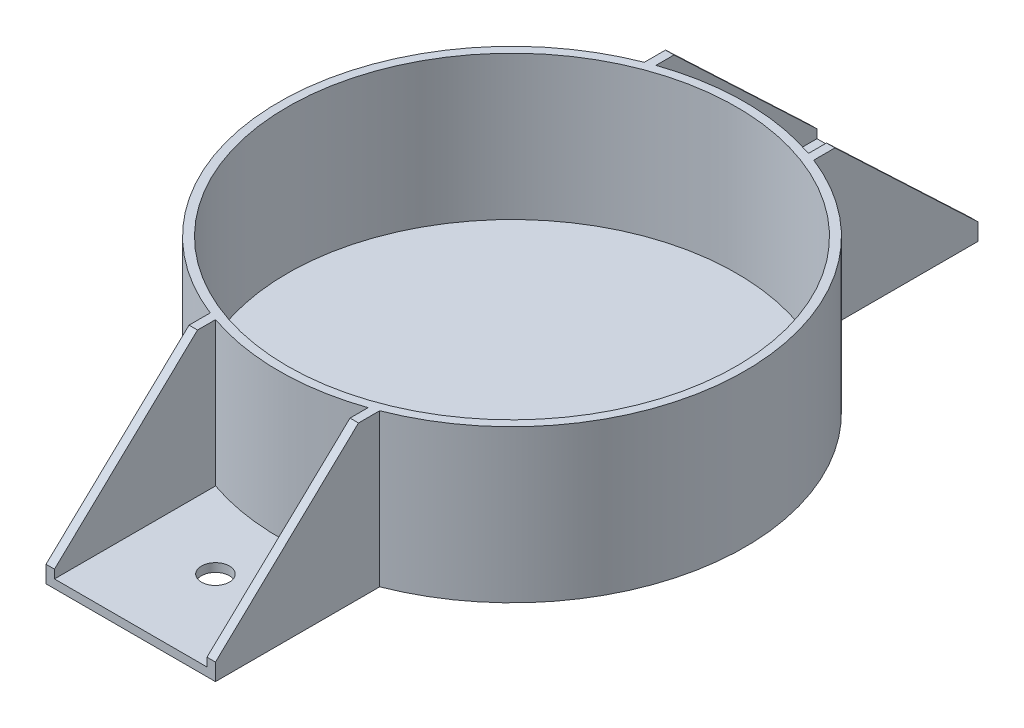
ISO-10303-21;
HEADER;
FILE_DESCRIPTION(('STEP AP214'),'2;1');
FILE_NAME('part.step','',(''),(''),'','','');
FILE_SCHEMA(('AUTOMOTIVE_DESIGN { 1 0 10303 214 1 1 1 1 }'));
ENDSEC;
DATA;
#1=APPLICATION_CONTEXT('core data for automotive mechanical design processes');
#2=APPLICATION_PROTOCOL_DEFINITION('international standard','automotive_design',2000,#1);
#3=PRODUCT_CONTEXT('',#1,'mechanical');
#4=PRODUCT('Part','Part','',(#3));
#5=PRODUCT_RELATED_PRODUCT_CATEGORY('part','',(#4));
#6=PRODUCT_DEFINITION_FORMATION('','',#4);
#7=PRODUCT_DEFINITION_CONTEXT('part definition',#1,'design');
#8=PRODUCT_DEFINITION('design','',#6,#7);
#9=PRODUCT_DEFINITION_SHAPE('','',#8);
#10=(LENGTH_UNIT() NAMED_UNIT(*) SI_UNIT(.MILLI.,.METRE.));
#11=(NAMED_UNIT(*) PLANE_ANGLE_UNIT() SI_UNIT($,.RADIAN.));
#12=(NAMED_UNIT(*) SI_UNIT($,.STERADIAN.) SOLID_ANGLE_UNIT());
#13=UNCERTAINTY_MEASURE_WITH_UNIT(LENGTH_MEASURE(1.E-05),#10,'distance_accuracy_value','');
#14=(GEOMETRIC_REPRESENTATION_CONTEXT(3) GLOBAL_UNCERTAINTY_ASSIGNED_CONTEXT((#13)) GLOBAL_UNIT_ASSIGNED_CONTEXT((#10,
#11,#12)) REPRESENTATION_CONTEXT('',''));
#15=CARTESIAN_POINT('',(0.,0.,0.));
#16=DIRECTION('',(0.,0.,1.));
#17=DIRECTION('',(1.,0.,0.));
#18=AXIS2_PLACEMENT_3D('',#15,#16,#17);
#19=CARTESIAN_POINT('',(10.,1.,-45.));
#20=DIRECTION('',(-1.,0.,0.));
#21=DIRECTION('',(0.,0.,1.));
#22=AXIS2_PLACEMENT_3D('',#19,#20,#21);
#23=PLANE('',#22);
#24=DIRECTION('',(0.,-0.687879130592936,-0.72582525561922));
#25=VECTOR('',#24,1.);
#26=CARTESIAN_POINT('',(10.,18.,-28.117376914899));
#27=LINE('',#26,#25);
#28=CARTESIAN_POINT('',(10.,18.,-28.117376914899));
#29=VERTEX_POINT('',#28);
#30=CARTESIAN_POINT('',(10.,2.,-45.));
#31=VERTEX_POINT('',#30);
#32=EDGE_CURVE('E171',#29,#31,#27,.T.);
#33=ORIENTED_EDGE('',*,*,#32,.F.);
#34=DIRECTION('',(0.,0.,-1.));
#35=VECTOR('',#34,1.);
#36=CARTESIAN_POINT('',(10.,18.,45.001));
#37=LINE('',#36,#35);
#38=CARTESIAN_POINT('',(10.,18.,-25.617376914899));
#39=VERTEX_POINT('',#38);
#40=EDGE_CURVE('E236',#39,#29,#37,.T.);
#41=ORIENTED_EDGE('',*,*,#40,.F.);
#42=DIRECTION('',(0.,-1.,0.));
#43=VECTOR('',#42,1.);
#44=CARTESIAN_POINT('',(10.,1.,-25.617376914899));
#45=LINE('',#44,#43);
#46=CARTESIAN_POINT('',(10.,0.,-25.617376914899));
#47=VERTEX_POINT('',#46);
#48=EDGE_CURVE('E195',#39,#47,#45,.T.);
#49=ORIENTED_EDGE('',*,*,#48,.T.);
#50=DIRECTION('',(0.,0.,-1.));
#51=VECTOR('',#50,1.);
#52=CARTESIAN_POINT('',(10.,0.,-45.));
#53=LINE('',#52,#51);
#54=CARTESIAN_POINT('',(10.,0.,-45.));
#55=VERTEX_POINT('',#54);
#56=EDGE_CURVE('E193',#47,#55,#53,.T.);
#57=ORIENTED_EDGE('',*,*,#56,.T.);
#58=DIRECTION('',(0.,-1.,0.));
#59=VECTOR('',#58,1.);
#60=CARTESIAN_POINT('',(10.,1.,-45.));
#61=LINE('',#60,#59);
#62=EDGE_CURVE('E186',#31,#55,#61,.T.);
#63=ORIENTED_EDGE('',*,*,#62,.F.);
#64=EDGE_LOOP('',(#33,#41,#49,#57,#63));
#65=FACE_BOUND('',#64,.T.);
#66=ADVANCED_FACE('F35',(#65),#23,.F.);
#67=CARTESIAN_POINT('',(-10.,1.,-45.));
#68=DIRECTION('',(0.,0.,1.));
#69=DIRECTION('',(1.,0.,0.));
#70=AXIS2_PLACEMENT_3D('',#67,#68,#69);
#71=PLANE('',#70);
#72=DIRECTION('',(-1.,0.,0.));
#73=VECTOR('',#72,1.);
#74=CARTESIAN_POINT('',(10.,2.,-45.));
#75=LINE('',#74,#73);
#76=CARTESIAN_POINT('',(9.,2.,-45.));
#77=VERTEX_POINT('',#76);
#78=EDGE_CURVE('E59',#31,#77,#75,.T.);
#79=ORIENTED_EDGE('',*,*,#78,.F.);
#80=ORIENTED_EDGE('',*,*,#62,.T.);
#81=DIRECTION('',(-1.,0.,0.));
#82=VECTOR('',#81,1.);
#83=CARTESIAN_POINT('',(-10.,0.,-45.));
#84=LINE('',#83,#82);
#85=CARTESIAN_POINT('',(-10.,0.,-45.));
#86=VERTEX_POINT('',#85);
#87=EDGE_CURVE('E335',#55,#86,#84,.T.);
#88=ORIENTED_EDGE('',*,*,#87,.T.);
#89=DIRECTION('',(0.,-1.,0.));
#90=VECTOR('',#89,1.);
#91=CARTESIAN_POINT('',(-10.,1.,-45.));
#92=LINE('',#91,#90);
#93=CARTESIAN_POINT('',(-10.,2.,-45.));
#94=VERTEX_POINT('',#93);
#95=EDGE_CURVE('E196',#94,#86,#92,.T.);
#96=ORIENTED_EDGE('',*,*,#95,.F.);
#97=CARTESIAN_POINT('',(-9.,2.,-45.));
#98=VERTEX_POINT('',#97);
#99=EDGE_CURVE('E179',#98,#94,#75,.T.);
#100=ORIENTED_EDGE('',*,*,#99,.F.);
#101=DIRECTION('',(0.,1.,0.));
#102=VECTOR('',#101,1.);
#103=CARTESIAN_POINT('',(-9.,1.,-45.));
#104=LINE('',#103,#102);
#105=CARTESIAN_POINT('',(-9.,1.,-45.));
#106=VERTEX_POINT('',#105);
#107=EDGE_CURVE('E247',#106,#98,#104,.T.);
#108=ORIENTED_EDGE('',*,*,#107,.F.);
#109=DIRECTION('',(-1.,0.,0.));
#110=VECTOR('',#109,1.);
#111=CARTESIAN_POINT('',(-10.,1.,-45.));
#112=LINE('',#111,#110);
#113=CARTESIAN_POINT('',(9.,1.,-45.));
#114=VERTEX_POINT('',#113);
#115=EDGE_CURVE('E319',#114,#106,#112,.T.);
#116=ORIENTED_EDGE('',*,*,#115,.F.);
#117=DIRECTION('',(0.,-1.,0.));
#118=VECTOR('',#117,1.);
#119=CARTESIAN_POINT('',(9.,1.,-45.));
#120=LINE('',#119,#118);
#121=EDGE_CURVE('E189',#77,#114,#120,.T.);
#122=ORIENTED_EDGE('',*,*,#121,.F.);
#123=EDGE_LOOP('',(#79,#80,#88,#96,#100,#108,#116,#122));
#124=FACE_BOUND('',#123,.T.);
#125=ADVANCED_FACE('F184',(#124),#71,.F.);
#126=CARTESIAN_POINT('',(-10.,1.,-25.617376914899));
#127=DIRECTION('',(1.,0.,0.));
#128=DIRECTION('',(0.,0.,-1.));
#129=AXIS2_PLACEMENT_3D('',#126,#127,#128);
#130=PLANE('',#129);
#131=DIRECTION('',(0.,-0.687879130592936,-0.72582525561922));
#132=VECTOR('',#131,1.);
#133=CARTESIAN_POINT('',(-10.,18.,-28.117376914899));
#134=LINE('',#133,#132);
#135=CARTESIAN_POINT('',(-10.,18.,-28.117376914899));
#136=VERTEX_POINT('',#135);
#137=EDGE_CURVE('E180',#136,#94,#134,.T.);
#138=ORIENTED_EDGE('',*,*,#137,.T.);
#139=ORIENTED_EDGE('',*,*,#95,.T.);
#140=DIRECTION('',(0.,0.,1.));
#141=VECTOR('',#140,1.);
#142=CARTESIAN_POINT('',(-10.,0.,-25.617376914899));
#143=LINE('',#142,#141);
#144=CARTESIAN_POINT('',(-10.,0.,-25.617376914899));
#145=VERTEX_POINT('',#144);
#146=EDGE_CURVE('E320',#86,#145,#143,.T.);
#147=ORIENTED_EDGE('',*,*,#146,.T.);
#148=DIRECTION('',(0.,-1.,0.));
#149=VECTOR('',#148,1.);
#150=CARTESIAN_POINT('',(-10.,1.,-25.617376914899));
#151=LINE('',#150,#149);
#152=CARTESIAN_POINT('',(-10.,18.,-25.617376914899));
#153=VERTEX_POINT('',#152);
#154=EDGE_CURVE('E200',#153,#145,#151,.T.);
#155=ORIENTED_EDGE('',*,*,#154,.F.);
#156=DIRECTION('',(0.,0.,-1.));
#157=VECTOR('',#156,1.);
#158=CARTESIAN_POINT('',(-10.,18.,45.001));
#159=LINE('',#158,#157);
#160=EDGE_CURVE('E246',#153,#136,#159,.T.);
#161=ORIENTED_EDGE('',*,*,#160,.T.);
#162=EDGE_LOOP('',(#138,#139,#147,#155,#161));
#163=FACE_BOUND('',#162,.T.);
#164=ADVANCED_FACE('F368',(#163),#130,.F.);
#165=CARTESIAN_POINT('',(0.,18.,0.));
#166=DIRECTION('',(0.,1.,0.));
#167=DIRECTION('',(0.,0.,1.));
#168=AXIS2_PLACEMENT_3D('',#165,#166,#167);
#169=PLANE('',#168);
#170=CARTESIAN_POINT('',(0.,18.,0.));
#171=DIRECTION('',(0.,1.,0.));
#172=DIRECTION('',(0.,0.,1.));
#173=AXIS2_PLACEMENT_3D('',#170,#171,#172);
#174=CIRCLE('',#173,26.5);
#175=CARTESIAN_POINT('',(0.,18.,26.5));
#176=VERTEX_POINT('',#175);
#177=EDGE_CURVE('E303',#176,#176,#174,.T.);
#178=ORIENTED_EDGE('',*,*,#177,.F.);
#179=EDGE_LOOP('',(#178));
#180=FACE_BOUND('',#179,.T.);
#181=ORIENTED_EDGE('',*,*,#40,.T.);
#182=DIRECTION('',(-1.,0.,0.));
#183=VECTOR('',#182,1.);
#184=CARTESIAN_POINT('',(10.,18.,-28.117376914899));
#185=LINE('',#184,#183);
#186=CARTESIAN_POINT('',(9.,18.,-28.117376914899));
#187=VERTEX_POINT('',#186);
#188=EDGE_CURVE('E174',#29,#187,#185,.T.);
#189=ORIENTED_EDGE('',*,*,#188,.T.);
#190=DIRECTION('',(0.,0.,-1.));
#191=VECTOR('',#190,1.);
#192=CARTESIAN_POINT('',(9.,18.,45.001));
#193=LINE('',#192,#191);
#194=CARTESIAN_POINT('',(9.00000000000001,18.,-25.9855729203726));
#195=VERTEX_POINT('',#194);
#196=EDGE_CURVE('E239',#195,#187,#193,.T.);
#197=ORIENTED_EDGE('',*,*,#196,.F.);
#198=CARTESIAN_POINT('',(0.,18.,0.));
#199=DIRECTION('',(0.,1.,0.));
#200=DIRECTION('',(0.,0.,1.));
#201=AXIS2_PLACEMENT_3D('',#198,#199,#200);
#202=CIRCLE('',#201,27.5);
#203=CARTESIAN_POINT('',(-9.,18.,-25.9855729203726));
#204=VERTEX_POINT('',#203);
#205=EDGE_CURVE('E314',#195,#204,#202,.T.);
#206=ORIENTED_EDGE('',*,*,#205,.T.);
#207=DIRECTION('',(0.,0.,-1.));
#208=VECTOR('',#207,1.);
#209=CARTESIAN_POINT('',(-9.,18.,45.001));
#210=LINE('',#209,#208);
#211=CARTESIAN_POINT('',(-9.,18.,-28.117376914899));
#212=VERTEX_POINT('',#211);
#213=EDGE_CURVE('E250',#204,#212,#210,.T.);
#214=ORIENTED_EDGE('',*,*,#213,.T.);
#215=EDGE_CURVE('E52',#212,#136,#185,.T.);
#216=ORIENTED_EDGE('',*,*,#215,.T.);
#217=ORIENTED_EDGE('',*,*,#160,.F.);
#218=CARTESIAN_POINT('',(-10.,18.,25.617376914899));
#219=VERTEX_POINT('',#218);
#220=EDGE_CURVE('E306',#153,#219,#202,.T.);
#221=ORIENTED_EDGE('',*,*,#220,.T.);
#222=DIRECTION('',(0.,0.,1.));
#223=VECTOR('',#222,1.);
#224=CARTESIAN_POINT('',(-10.,18.,-45.001));
#225=LINE('',#224,#223);
#226=CARTESIAN_POINT('',(-10.,18.,28.117376914899));
#227=VERTEX_POINT('',#226);
#228=EDGE_CURVE('E295',#219,#227,#225,.T.);
#229=ORIENTED_EDGE('',*,*,#228,.T.);
#230=DIRECTION('',(-1.,0.,0.));
#231=VECTOR('',#230,1.);
#232=CARTESIAN_POINT('',(10.,18.,28.117376914899));
#233=LINE('',#232,#231);
#234=CARTESIAN_POINT('',(-9.,18.,28.117376914899));
#235=VERTEX_POINT('',#234);
#236=EDGE_CURVE('E265',#235,#227,#233,.T.);
#237=ORIENTED_EDGE('',*,*,#236,.F.);
#238=DIRECTION('',(0.,0.,1.));
#239=VECTOR('',#238,1.);
#240=CARTESIAN_POINT('',(-9.,18.,-45.001));
#241=LINE('',#240,#239);
#242=CARTESIAN_POINT('',(-9.,18.,25.9855729203726));
#243=VERTEX_POINT('',#242);
#244=EDGE_CURVE('E294',#243,#235,#241,.T.);
#245=ORIENTED_EDGE('',*,*,#244,.F.);
#246=CARTESIAN_POINT('',(9.,18.,25.9855729203726));
#247=VERTEX_POINT('',#246);
#248=EDGE_CURVE('E309',#243,#247,#202,.T.);
#249=ORIENTED_EDGE('',*,*,#248,.T.);
#250=DIRECTION('',(0.,0.,1.));
#251=VECTOR('',#250,1.);
#252=CARTESIAN_POINT('',(9.,18.,-45.001));
#253=LINE('',#252,#251);
#254=CARTESIAN_POINT('',(9.,18.,28.117376914899));
#255=VERTEX_POINT('',#254);
#256=EDGE_CURVE('E284',#247,#255,#253,.T.);
#257=ORIENTED_EDGE('',*,*,#256,.T.);
#258=CARTESIAN_POINT('',(10.,18.,28.117376914899));
#259=VERTEX_POINT('',#258);
#260=EDGE_CURVE('E272',#259,#255,#233,.T.);
#261=ORIENTED_EDGE('',*,*,#260,.F.);
#262=DIRECTION('',(0.,0.,1.));
#263=VECTOR('',#262,1.);
#264=CARTESIAN_POINT('',(10.,18.,-45.001));
#265=LINE('',#264,#263);
#266=CARTESIAN_POINT('',(10.,18.,25.617376914899));
#267=VERTEX_POINT('',#266);
#268=EDGE_CURVE('E279',#267,#259,#265,.T.);
#269=ORIENTED_EDGE('',*,*,#268,.F.);
#270=EDGE_CURVE('E313',#267,#39,#202,.T.);
#271=ORIENTED_EDGE('',*,*,#270,.T.);
#272=EDGE_LOOP('',(#181,#189,#197,#206,#214,#216,#217,#221,#229,#237,#245,#249,#257,#261,#269,#271));
#273=FACE_BOUND('',#272,.T.);
#274=ADVANCED_FACE('F356',(#180,#273),#169,.T.);
#275=CARTESIAN_POINT('',(-9.,1.,45.001));
#276=DIRECTION('',(-1.,0.,0.));
#277=DIRECTION('',(0.,0.,1.));
#278=AXIS2_PLACEMENT_3D('',#275,#276,#277);
#279=PLANE('',#278);
#280=DIRECTION('',(0.,-0.687879130592936,-0.72582525561922));
#281=VECTOR('',#280,1.);
#282=CARTESIAN_POINT('',(-9.,46.4625257035375,1.91525392902749));
#283=LINE('',#282,#281);
#284=EDGE_CURVE('E231',#212,#98,#283,.T.);
#285=ORIENTED_EDGE('',*,*,#284,.F.);
#286=ORIENTED_EDGE('',*,*,#213,.F.);
#287=DIRECTION('',(0.,-1.,0.));
#288=VECTOR('',#287,1.);
#289=CARTESIAN_POINT('',(-9.,1.,-25.9855729203726));
#290=LINE('',#289,#288);
#291=CARTESIAN_POINT('',(-9.,1.,-25.9855729203726));
#292=VERTEX_POINT('',#291);
#293=EDGE_CURVE('E256',#292,#204,#290,.F.);
#294=ORIENTED_EDGE('',*,*,#293,.F.);
#295=DIRECTION('',(0.,0.,-1.));
#296=VECTOR('',#295,1.);
#297=CARTESIAN_POINT('',(-9.,1.,45.001));
#298=LINE('',#297,#296);
#299=EDGE_CURVE('E251',#292,#106,#298,.T.);
#300=ORIENTED_EDGE('',*,*,#299,.T.);
#301=ORIENTED_EDGE('',*,*,#107,.T.);
#302=EDGE_LOOP('',(#285,#286,#294,#300,#301));
#303=FACE_BOUND('',#302,.T.);
#304=ADVANCED_FACE('F375',(#303),#279,.F.);
#305=CARTESIAN_POINT('',(9.,1.,45.001));
#306=DIRECTION('',(1.,0.,0.));
#307=DIRECTION('',(0.,0.,-1.));
#308=AXIS2_PLACEMENT_3D('',#305,#306,#307);
#309=PLANE('',#308);
#310=DIRECTION('',(0.,0.687879130592936,0.72582525561922));
#311=VECTOR('',#310,1.);
#312=CARTESIAN_POINT('',(9.,46.4625257035375,1.91525392902749));
#313=LINE('',#312,#311);
#314=EDGE_CURVE('E11',#77,#187,#313,.T.);
#315=ORIENTED_EDGE('',*,*,#314,.F.);
#316=ORIENTED_EDGE('',*,*,#121,.T.);
#317=DIRECTION('',(0.,0.,-1.));
#318=VECTOR('',#317,1.);
#319=CARTESIAN_POINT('',(9.,1.,45.001));
#320=LINE('',#319,#318);
#321=CARTESIAN_POINT('',(9.,1.,-25.9855729203726));
#322=VERTEX_POINT('',#321);
#323=EDGE_CURVE('E235',#322,#114,#320,.T.);
#324=ORIENTED_EDGE('',*,*,#323,.F.);
#325=DIRECTION('',(0.,-1.,0.));
#326=VECTOR('',#325,1.);
#327=CARTESIAN_POINT('',(9.,1.,-25.9855729203726));
#328=LINE('',#327,#326);
#329=EDGE_CURVE('E238',#195,#322,#328,.T.);
#330=ORIENTED_EDGE('',*,*,#329,.F.);
#331=ORIENTED_EDGE('',*,*,#196,.T.);
#332=EDGE_LOOP('',(#315,#316,#324,#330,#331));
#333=FACE_BOUND('',#332,.T.);
#334=ADVANCED_FACE('F383',(#333),#309,.F.);
#335=CARTESIAN_POINT('',(0.,1.,0.));
#336=DIRECTION('',(0.,1.,0.));
#337=DIRECTION('',(0.,0.,1.));
#338=AXIS2_PLACEMENT_3D('',#335,#336,#337);
#339=PLANE('',#338);
#340=CARTESIAN_POINT('',(0.,1.,-35.));
#341=DIRECTION('',(0.,1.,0.));
#342=DIRECTION('',(0.,0.,1.));
#343=AXIS2_PLACEMENT_3D('',#340,#341,#342);
#344=CIRCLE('',#343,1.65);
#345=CARTESIAN_POINT('',(0.,1.,-33.35));
#346=VERTEX_POINT('',#345);
#347=EDGE_CURVE('E217',#346,#346,#344,.T.);
#348=ORIENTED_EDGE('',*,*,#347,.F.);
#349=EDGE_LOOP('',(#348));
#350=FACE_BOUND('',#349,.T.);
#351=CARTESIAN_POINT('',(0.,1.,0.));
#352=DIRECTION('',(0.,1.,0.));
#353=DIRECTION('',(0.,0.,1.));
#354=AXIS2_PLACEMENT_3D('',#351,#352,#353);
#355=CIRCLE('',#354,27.5);
#356=EDGE_CURVE('E214',#322,#292,#355,.T.);
#357=ORIENTED_EDGE('',*,*,#356,.F.);
#358=ORIENTED_EDGE('',*,*,#323,.T.);
#359=ORIENTED_EDGE('',*,*,#115,.T.);
#360=ORIENTED_EDGE('',*,*,#299,.F.);
#361=EDGE_LOOP('',(#357,#358,#359,#360));
#362=FACE_BOUND('',#361,.T.);
#363=ADVANCED_FACE('F381',(#350,#362),#339,.T.);
#364=CARTESIAN_POINT('',(0.,1.,0.));
#365=DIRECTION('',(0.,-1.,0.));
#366=DIRECTION('',(0.,0.,-1.));
#367=AXIS2_PLACEMENT_3D('',#364,#365,#366);
#368=CYLINDRICAL_SURFACE('',#367,27.5);
#369=ORIENTED_EDGE('',*,*,#329,.T.);
#370=ORIENTED_EDGE('',*,*,#356,.T.);
#371=ORIENTED_EDGE('',*,*,#293,.T.);
#372=ORIENTED_EDGE('',*,*,#205,.F.);
#373=EDGE_LOOP('',(#369,#370,#371,#372));
#374=FACE_BOUND('',#373,.T.);
#375=ADVANCED_FACE('F378',(#374),#368,.T.);
#376=ORIENTED_EDGE('',*,*,#48,.F.);
#377=ORIENTED_EDGE('',*,*,#270,.F.);
#378=DIRECTION('',(0.,-1.,0.));
#379=VECTOR('',#378,1.);
#380=CARTESIAN_POINT('',(10.,1.,25.617376914899));
#381=LINE('',#380,#379);
#382=CARTESIAN_POINT('',(10.,0.,25.617376914899));
#383=VERTEX_POINT('',#382);
#384=EDGE_CURVE('E198',#267,#383,#381,.T.);
#385=ORIENTED_EDGE('',*,*,#384,.T.);
#386=CARTESIAN_POINT('',(0.,0.,0.));
#387=DIRECTION('',(0.,1.,0.));
#388=DIRECTION('',(0.,0.,1.));
#389=AXIS2_PLACEMENT_3D('',#386,#387,#388);
#390=CIRCLE('',#389,27.5);
#391=EDGE_CURVE('E332',#383,#47,#390,.T.);
#392=ORIENTED_EDGE('',*,*,#391,.T.);
#393=EDGE_LOOP('',(#376,#377,#385,#392));
#394=FACE_BOUND('',#393,.T.);
#395=ADVANCED_FACE('F363',(#394),#368,.T.);
#396=ORIENTED_EDGE('',*,*,#220,.F.);
#397=ORIENTED_EDGE('',*,*,#154,.T.);
#398=CARTESIAN_POINT('',(0.,0.,0.));
#399=DIRECTION('',(0.,1.,0.));
#400=DIRECTION('',(0.,0.,1.));
#401=AXIS2_PLACEMENT_3D('',#398,#399,#400);
#402=CIRCLE('',#401,27.5);
#403=CARTESIAN_POINT('',(-10.,0.,25.617376914899));
#404=VERTEX_POINT('',#403);
#405=EDGE_CURVE('E312',#145,#404,#402,.T.);
#406=ORIENTED_EDGE('',*,*,#405,.T.);
#407=DIRECTION('',(0.,-1.,0.));
#408=VECTOR('',#407,1.);
#409=CARTESIAN_POINT('',(-10.,1.,25.617376914899));
#410=LINE('',#409,#408);
#411=EDGE_CURVE('E210',#219,#404,#410,.T.);
#412=ORIENTED_EDGE('',*,*,#411,.F.);
#413=EDGE_LOOP('',(#396,#397,#406,#412));
#414=FACE_BOUND('',#413,.T.);
#415=ADVANCED_FACE('F341',(#414),#368,.T.);
#416=CARTESIAN_POINT('',(-9.,1.,25.9855729203726));
#417=VERTEX_POINT('',#416);
#418=CARTESIAN_POINT('',(9.,1.,25.9855729203726));
#419=VERTEX_POINT('',#418);
#420=EDGE_CURVE('E213',#417,#419,#355,.T.);
#421=ORIENTED_EDGE('',*,*,#420,.T.);
#422=DIRECTION('',(0.,-1.,0.));
#423=VECTOR('',#422,1.);
#424=CARTESIAN_POINT('',(9.,1.,25.9855729203726));
#425=LINE('',#424,#423);
#426=EDGE_CURVE('E275',#247,#419,#425,.T.);
#427=ORIENTED_EDGE('',*,*,#426,.F.);
#428=ORIENTED_EDGE('',*,*,#248,.F.);
#429=DIRECTION('',(0.,-1.,0.));
#430=VECTOR('',#429,1.);
#431=CARTESIAN_POINT('',(-9.,1.,25.9855729203726));
#432=LINE('',#431,#430);
#433=EDGE_CURVE('E292',#417,#243,#432,.F.);
#434=ORIENTED_EDGE('',*,*,#433,.F.);
#435=EDGE_LOOP('',(#421,#427,#428,#434));
#436=FACE_BOUND('',#435,.T.);
#437=ADVANCED_FACE('F406',(#436),#368,.T.);
#438=CARTESIAN_POINT('',(-10.,1.,25.617376914899));
#439=DIRECTION('',(1.,0.,0.));
#440=DIRECTION('',(0.,0.,-1.));
#441=AXIS2_PLACEMENT_3D('',#438,#439,#440);
#442=PLANE('',#441);
#443=DIRECTION('',(0.,-1.,0.));
#444=VECTOR('',#443,1.);
#445=CARTESIAN_POINT('',(-10.,1.,45.));
#446=LINE('',#445,#444);
#447=CARTESIAN_POINT('',(-10.,2.,45.));
#448=VERTEX_POINT('',#447);
#449=CARTESIAN_POINT('',(-10.,0.,45.));
#450=VERTEX_POINT('',#449);
#451=EDGE_CURVE('E208',#448,#450,#446,.T.);
#452=ORIENTED_EDGE('',*,*,#451,.F.);
#453=DIRECTION('',(0.,-0.687879130592936,0.72582525561922));
#454=VECTOR('',#453,1.);
#455=CARTESIAN_POINT('',(-10.,18.,28.117376914899));
#456=LINE('',#455,#454);
#457=EDGE_CURVE('E261',#227,#448,#456,.T.);
#458=ORIENTED_EDGE('',*,*,#457,.F.);
#459=ORIENTED_EDGE('',*,*,#228,.F.);
#460=ORIENTED_EDGE('',*,*,#411,.T.);
#461=DIRECTION('',(0.,0.,1.));
#462=VECTOR('',#461,1.);
#463=CARTESIAN_POINT('',(-10.,0.,25.617376914899));
#464=LINE('',#463,#462);
#465=EDGE_CURVE('E324',#404,#450,#464,.T.);
#466=ORIENTED_EDGE('',*,*,#465,.T.);
#467=EDGE_LOOP('',(#452,#458,#459,#460,#466));
#468=FACE_BOUND('',#467,.T.);
#469=ADVANCED_FACE('F37',(#468),#442,.F.);
#470=CARTESIAN_POINT('',(-10.,1.,45.));
#471=DIRECTION('',(0.,0.,-1.));
#472=DIRECTION('',(-1.,0.,0.));
#473=AXIS2_PLACEMENT_3D('',#470,#471,#472);
#474=PLANE('',#473);
#475=DIRECTION('',(0.,-1.,0.));
#476=VECTOR('',#475,1.);
#477=CARTESIAN_POINT('',(10.,1.,45.));
#478=LINE('',#477,#476);
#479=CARTESIAN_POINT('',(10.,2.,45.));
#480=VERTEX_POINT('',#479);
#481=CARTESIAN_POINT('',(10.,0.,45.));
#482=VERTEX_POINT('',#481);
#483=EDGE_CURVE('E206',#480,#482,#478,.T.);
#484=ORIENTED_EDGE('',*,*,#483,.F.);
#485=DIRECTION('',(-1.,0.,0.));
#486=VECTOR('',#485,1.);
#487=CARTESIAN_POINT('',(10.,2.,45.));
#488=LINE('',#487,#486);
#489=CARTESIAN_POINT('',(9.,2.,45.));
#490=VERTEX_POINT('',#489);
#491=EDGE_CURVE('E267',#480,#490,#488,.T.);
#492=ORIENTED_EDGE('',*,*,#491,.T.);
#493=DIRECTION('',(0.,-1.,0.));
#494=VECTOR('',#493,1.);
#495=CARTESIAN_POINT('',(9.,1.,45.));
#496=LINE('',#495,#494);
#497=CARTESIAN_POINT('',(9.,1.,45.));
#498=VERTEX_POINT('',#497);
#499=EDGE_CURVE('E276',#490,#498,#496,.T.);
#500=ORIENTED_EDGE('',*,*,#499,.T.);
#501=DIRECTION('',(1.,0.,0.));
#502=VECTOR('',#501,1.);
#503=CARTESIAN_POINT('',(-10.,1.,45.));
#504=LINE('',#503,#502);
#505=CARTESIAN_POINT('',(-9.,1.,45.));
#506=VERTEX_POINT('',#505);
#507=EDGE_CURVE('E316',#506,#498,#504,.T.);
#508=ORIENTED_EDGE('',*,*,#507,.F.);
#509=DIRECTION('',(0.,1.,0.));
#510=VECTOR('',#509,1.);
#511=CARTESIAN_POINT('',(-9.,1.,45.));
#512=LINE('',#511,#510);
#513=CARTESIAN_POINT('',(-9.,1.99999999999999,45.));
#514=VERTEX_POINT('',#513);
#515=EDGE_CURVE('E278',#506,#514,#512,.T.);
#516=ORIENTED_EDGE('',*,*,#515,.T.);
#517=EDGE_CURVE('E271',#514,#448,#488,.T.);
#518=ORIENTED_EDGE('',*,*,#517,.T.);
#519=ORIENTED_EDGE('',*,*,#451,.T.);
#520=DIRECTION('',(1.,0.,0.));
#521=VECTOR('',#520,1.);
#522=CARTESIAN_POINT('',(-10.,0.,45.));
#523=LINE('',#522,#521);
#524=EDGE_CURVE('E327',#450,#482,#523,.T.);
#525=ORIENTED_EDGE('',*,*,#524,.T.);
#526=EDGE_LOOP('',(#484,#492,#500,#508,#516,#518,#519,#525));
#527=FACE_BOUND('',#526,.T.);
#528=ADVANCED_FACE('F409',(#527),#474,.F.);
#529=CARTESIAN_POINT('',(10.,1.,45.));
#530=DIRECTION('',(-1.,0.,0.));
#531=DIRECTION('',(0.,0.,1.));
#532=AXIS2_PLACEMENT_3D('',#529,#530,#531);
#533=PLANE('',#532);
#534=ORIENTED_EDGE('',*,*,#268,.T.);
#535=DIRECTION('',(0.,-0.687879130592936,0.72582525561922));
#536=VECTOR('',#535,1.);
#537=CARTESIAN_POINT('',(10.,18.,28.117376914899));
#538=LINE('',#537,#536);
#539=EDGE_CURVE('E262',#259,#480,#538,.T.);
#540=ORIENTED_EDGE('',*,*,#539,.T.);
#541=ORIENTED_EDGE('',*,*,#483,.T.);
#542=DIRECTION('',(0.,0.,-1.));
#543=VECTOR('',#542,1.);
#544=CARTESIAN_POINT('',(10.,0.,45.));
#545=LINE('',#544,#543);
#546=EDGE_CURVE('E330',#482,#383,#545,.T.);
#547=ORIENTED_EDGE('',*,*,#546,.T.);
#548=ORIENTED_EDGE('',*,*,#384,.F.);
#549=EDGE_LOOP('',(#534,#540,#541,#547,#548));
#550=FACE_BOUND('',#549,.T.);
#551=ADVANCED_FACE('F407',(#550),#533,.F.);
#552=CARTESIAN_POINT('',(0.,1.,35.));
#553=DIRECTION('',(0.,1.,0.));
#554=DIRECTION('',(0.,0.,-1.));
#555=AXIS2_PLACEMENT_3D('',#552,#553,#554);
#556=CIRCLE('',#555,1.65);
#557=CARTESIAN_POINT('',(0.,1.,33.35));
#558=VERTEX_POINT('',#557);
#559=EDGE_CURVE('E222',#558,#558,#556,.T.);
#560=ORIENTED_EDGE('',*,*,#559,.F.);
#561=EDGE_LOOP('',(#560));
#562=FACE_BOUND('',#561,.T.);
#563=DIRECTION('',(0.,0.,1.));
#564=VECTOR('',#563,1.);
#565=CARTESIAN_POINT('',(9.,1.,-45.001));
#566=LINE('',#565,#564);
#567=EDGE_CURVE('E281',#419,#498,#566,.T.);
#568=ORIENTED_EDGE('',*,*,#567,.F.);
#569=ORIENTED_EDGE('',*,*,#420,.F.);
#570=DIRECTION('',(0.,0.,1.));
#571=VECTOR('',#570,1.);
#572=CARTESIAN_POINT('',(-9.,1.,-45.001));
#573=LINE('',#572,#571);
#574=EDGE_CURVE('E291',#417,#506,#573,.T.);
#575=ORIENTED_EDGE('',*,*,#574,.T.);
#576=ORIENTED_EDGE('',*,*,#507,.T.);
#577=EDGE_LOOP('',(#568,#569,#575,#576));
#578=FACE_BOUND('',#577,.T.);
#579=ADVANCED_FACE('F393',(#562,#578),#339,.T.);
#580=CARTESIAN_POINT('',(0.,0.,0.));
#581=DIRECTION('',(0.,1.,0.));
#582=DIRECTION('',(0.,0.,1.));
#583=AXIS2_PLACEMENT_3D('',#580,#581,#582);
#584=PLANE('',#583);
#585=CARTESIAN_POINT('',(0.,0.,-35.));
#586=DIRECTION('',(0.,1.,0.));
#587=DIRECTION('',(0.,0.,1.));
#588=AXIS2_PLACEMENT_3D('',#585,#586,#587);
#589=CIRCLE('',#588,1.65);
#590=CARTESIAN_POINT('',(0.,0.,-33.35));
#591=VERTEX_POINT('',#590);
#592=EDGE_CURVE('E39',#591,#591,#589,.T.);
#593=ORIENTED_EDGE('',*,*,#592,.T.);
#594=EDGE_LOOP('',(#593));
#595=FACE_BOUND('',#594,.T.);
#596=CARTESIAN_POINT('',(0.,0.,35.));
#597=DIRECTION('',(0.,1.,0.));
#598=DIRECTION('',(0.,0.,1.));
#599=AXIS2_PLACEMENT_3D('',#596,#597,#598);
#600=CIRCLE('',#599,1.65);
#601=CARTESIAN_POINT('',(0.,0.,36.65));
#602=VERTEX_POINT('',#601);
#603=EDGE_CURVE('E215',#602,#602,#600,.T.);
#604=ORIENTED_EDGE('',*,*,#603,.T.);
#605=EDGE_LOOP('',(#604));
#606=FACE_BOUND('',#605,.T.);
#607=ORIENTED_EDGE('',*,*,#405,.F.);
#608=ORIENTED_EDGE('',*,*,#146,.F.);
#609=ORIENTED_EDGE('',*,*,#87,.F.);
#610=ORIENTED_EDGE('',*,*,#56,.F.);
#611=ORIENTED_EDGE('',*,*,#391,.F.);
#612=ORIENTED_EDGE('',*,*,#546,.F.);
#613=ORIENTED_EDGE('',*,*,#524,.F.);
#614=ORIENTED_EDGE('',*,*,#465,.F.);
#615=EDGE_LOOP('',(#607,#608,#609,#610,#611,#612,#613,#614));
#616=FACE_BOUND('',#615,.T.);
#617=ADVANCED_FACE('F347',(#595,#606,#616),#584,.F.);
#618=CARTESIAN_POINT('',(0.,18.,0.));
#619=DIRECTION('',(0.,-1.,0.));
#620=DIRECTION('',(0.,0.,-1.));
#621=AXIS2_PLACEMENT_3D('',#618,#619,#620);
#622=CYLINDRICAL_SURFACE('',#621,26.5);
#623=ORIENTED_EDGE('',*,*,#177,.T.);
#624=EDGE_LOOP('',(#623));
#625=FACE_BOUND('',#624,.T.);
#626=CARTESIAN_POINT('',(0.,1.,0.));
#627=DIRECTION('',(0.,1.,0.));
#628=DIRECTION('',(0.,0.,1.));
#629=AXIS2_PLACEMENT_3D('',#626,#627,#628);
#630=CIRCLE('',#629,26.5);
#631=CARTESIAN_POINT('',(0.,1.,26.5));
#632=VERTEX_POINT('',#631);
#633=EDGE_CURVE('E298',#632,#632,#630,.T.);
#634=ORIENTED_EDGE('',*,*,#633,.F.);
#635=EDGE_LOOP('',(#634));
#636=FACE_BOUND('',#635,.T.);
#637=ADVANCED_FACE('F449',(#625,#636),#622,.F.);
#638=ORIENTED_EDGE('',*,*,#633,.T.);
#639=EDGE_LOOP('',(#638));
#640=FACE_BOUND('',#639,.T.);
#641=ADVANCED_FACE('F392',(#640),#339,.T.);
#642=CARTESIAN_POINT('',(-9.,1.,-45.001));
#643=DIRECTION('',(1.,0.,0.));
#644=DIRECTION('',(0.,0.,-1.));
#645=AXIS2_PLACEMENT_3D('',#642,#643,#644);
#646=PLANE('',#645);
#647=DIRECTION('',(0.,0.687879130592936,-0.72582525561922));
#648=VECTOR('',#647,1.);
#649=CARTESIAN_POINT('',(-9.,46.4625257035375,-1.91525392902749));
#650=LINE('',#649,#648);
#651=EDGE_CURVE('E270',#514,#235,#650,.T.);
#652=ORIENTED_EDGE('',*,*,#651,.F.);
#653=ORIENTED_EDGE('',*,*,#515,.F.);
#654=ORIENTED_EDGE('',*,*,#574,.F.);
#655=ORIENTED_EDGE('',*,*,#433,.T.);
#656=ORIENTED_EDGE('',*,*,#244,.T.);
#657=EDGE_LOOP('',(#652,#653,#654,#655,#656));
#658=FACE_BOUND('',#657,.T.);
#659=ADVANCED_FACE('F435',(#658),#646,.T.);
#660=CARTESIAN_POINT('',(9.,1.,-45.001));
#661=DIRECTION('',(-1.,0.,0.));
#662=DIRECTION('',(0.,0.,1.));
#663=AXIS2_PLACEMENT_3D('',#660,#661,#662);
#664=PLANE('',#663);
#665=DIRECTION('',(0.,-0.687879130592936,0.72582525561922));
#666=VECTOR('',#665,1.);
#667=CARTESIAN_POINT('',(9.,46.4625257035375,-1.91525392902749));
#668=LINE('',#667,#666);
#669=EDGE_CURVE('E44',#255,#490,#668,.T.);
#670=ORIENTED_EDGE('',*,*,#669,.F.);
#671=ORIENTED_EDGE('',*,*,#256,.F.);
#672=ORIENTED_EDGE('',*,*,#426,.T.);
#673=ORIENTED_EDGE('',*,*,#567,.T.);
#674=ORIENTED_EDGE('',*,*,#499,.F.);
#675=EDGE_LOOP('',(#670,#671,#672,#673,#674));
#676=FACE_BOUND('',#675,.T.);
#677=ADVANCED_FACE('F424',(#676),#664,.T.);
#678=CARTESIAN_POINT('',(10.,18.,28.117376914899));
#679=DIRECTION('',(0.,-0.72582525561922,-0.687879130592936));
#680=DIRECTION('',(0.,0.687879130592936,-0.72582525561922));
#681=AXIS2_PLACEMENT_3D('',#678,#679,#680);
#682=PLANE('',#681);
#683=ORIENTED_EDGE('',*,*,#669,.T.);
#684=ORIENTED_EDGE('',*,*,#491,.F.);
#685=ORIENTED_EDGE('',*,*,#539,.F.);
#686=ORIENTED_EDGE('',*,*,#260,.T.);
#687=EDGE_LOOP('',(#683,#684,#685,#686));
#688=FACE_BOUND('',#687,.T.);
#689=ADVANCED_FACE('F419',(#688),#682,.F.);
#690=ORIENTED_EDGE('',*,*,#651,.T.);
#691=ORIENTED_EDGE('',*,*,#236,.T.);
#692=ORIENTED_EDGE('',*,*,#457,.T.);
#693=ORIENTED_EDGE('',*,*,#517,.F.);
#694=EDGE_LOOP('',(#690,#691,#692,#693));
#695=FACE_BOUND('',#694,.T.);
#696=ADVANCED_FACE('F437',(#695),#682,.F.);
#697=CARTESIAN_POINT('',(10.,18.,-28.117376914899));
#698=DIRECTION('',(0.,0.72582525561922,-0.687879130592936));
#699=DIRECTION('',(0.,0.687879130592936,0.72582525561922));
#700=AXIS2_PLACEMENT_3D('',#697,#698,#699);
#701=PLANE('',#700);
#702=ORIENTED_EDGE('',*,*,#314,.T.);
#703=ORIENTED_EDGE('',*,*,#188,.F.);
#704=ORIENTED_EDGE('',*,*,#32,.T.);
#705=ORIENTED_EDGE('',*,*,#78,.T.);
#706=EDGE_LOOP('',(#702,#703,#704,#705));
#707=FACE_BOUND('',#706,.T.);
#708=ADVANCED_FACE('F172',(#707),#701,.T.);
#709=ORIENTED_EDGE('',*,*,#284,.T.);
#710=ORIENTED_EDGE('',*,*,#99,.T.);
#711=ORIENTED_EDGE('',*,*,#137,.F.);
#712=ORIENTED_EDGE('',*,*,#215,.F.);
#713=EDGE_LOOP('',(#709,#710,#711,#712));
#714=FACE_BOUND('',#713,.T.);
#715=ADVANCED_FACE('F369',(#714),#701,.T.);
#716=CARTESIAN_POINT('',(0.,-19.,35.));
#717=DIRECTION('',(0.,1.,0.));
#718=DIRECTION('',(0.,0.,1.));
#719=AXIS2_PLACEMENT_3D('',#716,#717,#718);
#720=CYLINDRICAL_SURFACE('',#719,1.65);
#721=ORIENTED_EDGE('',*,*,#559,.T.);
#722=EDGE_LOOP('',(#721));
#723=FACE_BOUND('',#722,.T.);
#724=ORIENTED_EDGE('',*,*,#603,.F.);
#725=EDGE_LOOP('',(#724));
#726=FACE_BOUND('',#725,.T.);
#727=ADVANCED_FACE('F521',(#723,#726),#720,.F.);
#728=CARTESIAN_POINT('',(0.,-19.,-35.));
#729=DIRECTION('',(0.,1.,0.));
#730=DIRECTION('',(0.,0.,1.));
#731=AXIS2_PLACEMENT_3D('',#728,#729,#730);
#732=CYLINDRICAL_SURFACE('',#731,1.65);
#733=ORIENTED_EDGE('',*,*,#347,.T.);
#734=EDGE_LOOP('',(#733));
#735=FACE_BOUND('',#734,.T.);
#736=ORIENTED_EDGE('',*,*,#592,.F.);
#737=EDGE_LOOP('',(#736));
#738=FACE_BOUND('',#737,.T.);
#739=ADVANCED_FACE('F548',(#735,#738),#732,.F.);
#740=CLOSED_SHELL('',(#66,#125,#164,#274,#304,#334,#363,#375,#395,#415,#437,#469,#528,#551,#579,
#617,#637,#641,#659,#677,#689,#696,#708,#715,#727,#739));
#741=MANIFOLD_SOLID_BREP('B2',#740);
#742=ADVANCED_BREP_SHAPE_REPRESENTATION('',(#18,#741),#14);
#743=SHAPE_DEFINITION_REPRESENTATION(#9,#742);
ENDSEC;
END-ISO-10303-21;
